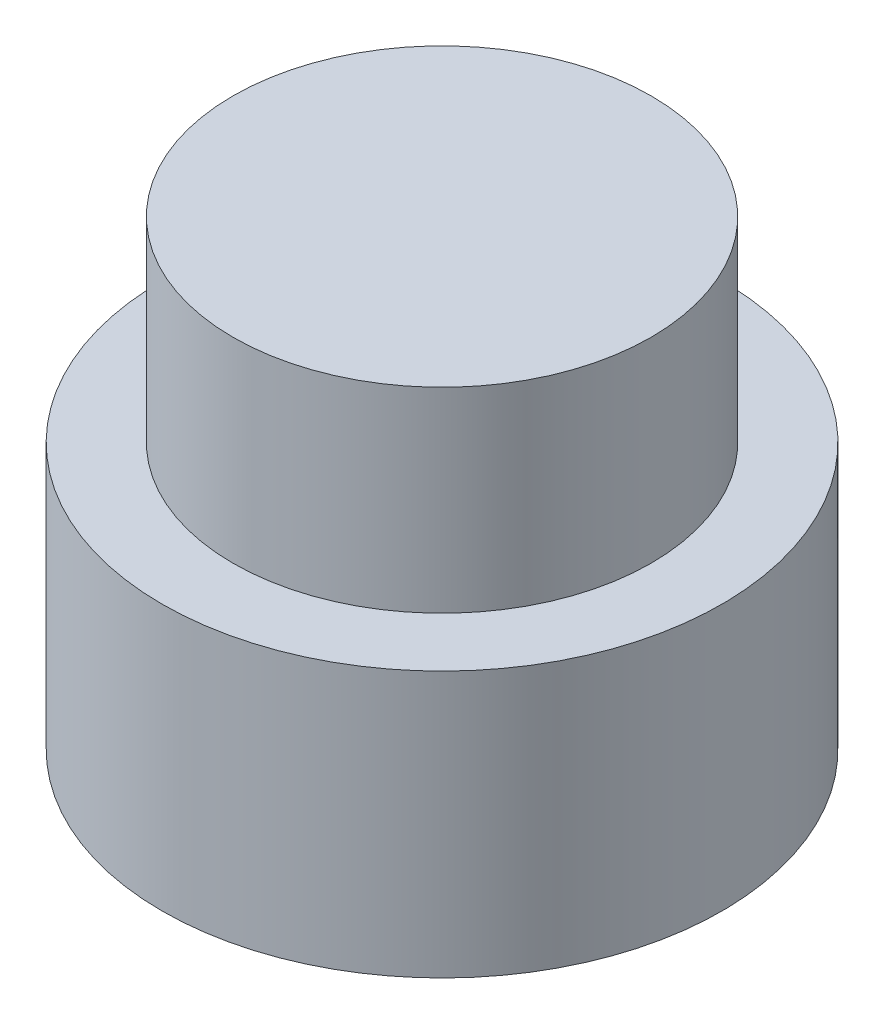
ISO-10303-21;
HEADER;
FILE_DESCRIPTION(('STEP AP214'),'2;1');
FILE_NAME('part.step','',(''),(''),'','','');
FILE_SCHEMA(('AUTOMOTIVE_DESIGN { 1 0 10303 214 1 1 1 1 }'));
ENDSEC;
DATA;
#1=APPLICATION_CONTEXT('core data for automotive mechanical design processes');
#2=APPLICATION_PROTOCOL_DEFINITION('international standard','automotive_design',2000,#1);
#3=PRODUCT_CONTEXT('',#1,'mechanical');
#4=PRODUCT('Part','Part','',(#3));
#5=PRODUCT_RELATED_PRODUCT_CATEGORY('part','',(#4));
#6=PRODUCT_DEFINITION_FORMATION('','',#4);
#7=PRODUCT_DEFINITION_CONTEXT('part definition',#1,'design');
#8=PRODUCT_DEFINITION('design','',#6,#7);
#9=PRODUCT_DEFINITION_SHAPE('','',#8);
#10=(LENGTH_UNIT() NAMED_UNIT(*) SI_UNIT(.MILLI.,.METRE.));
#11=(NAMED_UNIT(*) PLANE_ANGLE_UNIT() SI_UNIT($,.RADIAN.));
#12=(NAMED_UNIT(*) SI_UNIT($,.STERADIAN.) SOLID_ANGLE_UNIT());
#13=UNCERTAINTY_MEASURE_WITH_UNIT(LENGTH_MEASURE(1.E-05),#10,'distance_accuracy_value','');
#14=(GEOMETRIC_REPRESENTATION_CONTEXT(3) GLOBAL_UNCERTAINTY_ASSIGNED_CONTEXT((#13)) GLOBAL_UNIT_ASSIGNED_CONTEXT((#10,
#11,#12)) REPRESENTATION_CONTEXT('',''));
#15=CARTESIAN_POINT('',(0.,0.,0.));
#16=DIRECTION('',(0.,0.,1.));
#17=DIRECTION('',(1.,0.,0.));
#18=AXIS2_PLACEMENT_3D('',#15,#16,#17);
#19=CARTESIAN_POINT('',(0.,0.,0.));
#20=DIRECTION('',(0.,1.,0.));
#21=DIRECTION('',(0.,0.,1.));
#22=AXIS2_PLACEMENT_3D('',#19,#20,#21);
#23=PLANE('',#22);
#24=CARTESIAN_POINT('',(0.,0.,0.));
#25=DIRECTION('',(0.,-1.,0.));
#26=DIRECTION('',(0.,0.,-1.));
#27=AXIS2_PLACEMENT_3D('',#24,#25,#26);
#28=CIRCLE('',#27,2.5);
#29=CARTESIAN_POINT('',(0.,0.,-2.5));
#30=VERTEX_POINT('',#29);
#31=EDGE_CURVE('E67',#30,#30,#28,.T.);
#32=ORIENTED_EDGE('',*,*,#31,.F.);
#33=EDGE_LOOP('',(#32));
#34=FACE_BOUND('',#33,.T.);
#35=CARTESIAN_POINT('',(0.,0.,0.));
#36=DIRECTION('',(0.,1.,0.));
#37=DIRECTION('',(0.,0.,1.));
#38=AXIS2_PLACEMENT_3D('',#35,#36,#37);
#39=CIRCLE('',#38,7.9);
#40=CARTESIAN_POINT('',(0.,0.,7.9));
#41=VERTEX_POINT('',#40);
#42=EDGE_CURVE('E10',#41,#41,#39,.T.);
#43=ORIENTED_EDGE('',*,*,#42,.F.);
#44=EDGE_LOOP('',(#43));
#45=FACE_BOUND('',#44,.T.);
#46=ADVANCED_FACE('F43',(#34,#45),#23,.F.);
#47=CARTESIAN_POINT('',(0.,13.0223744292237,0.));
#48=DIRECTION('',(0.,1.,0.));
#49=DIRECTION('',(0.,0.,1.));
#50=AXIS2_PLACEMENT_3D('',#47,#48,#49);
#51=CYLINDRICAL_SURFACE('',#50,7.9);
#52=CARTESIAN_POINT('',(0.,7.5,0.));
#53=DIRECTION('',(0.,1.,0.));
#54=DIRECTION('',(0.,0.,1.));
#55=AXIS2_PLACEMENT_3D('',#52,#53,#54);
#56=CIRCLE('',#55,7.9);
#57=CARTESIAN_POINT('',(0.,7.5,7.9));
#58=VERTEX_POINT('',#57);
#59=EDGE_CURVE('E50',#58,#58,#56,.T.);
#60=ORIENTED_EDGE('',*,*,#59,.F.);
#61=EDGE_LOOP('',(#60));
#62=FACE_BOUND('',#61,.T.);
#63=ORIENTED_EDGE('',*,*,#42,.T.);
#64=EDGE_LOOP('',(#63));
#65=FACE_BOUND('',#64,.T.);
#66=ADVANCED_FACE('F86',(#62,#65),#51,.T.);
#67=CARTESIAN_POINT('',(7.9,7.5,0.));
#68=DIRECTION('',(0.,-1.,0.));
#69=DIRECTION('',(0.,0.,-1.));
#70=AXIS2_PLACEMENT_3D('',#67,#68,#69);
#71=PLANE('',#70);
#72=CARTESIAN_POINT('',(0.,7.5,0.));
#73=DIRECTION('',(0.,1.,0.));
#74=DIRECTION('',(0.,0.,1.));
#75=AXIS2_PLACEMENT_3D('',#72,#73,#74);
#76=CIRCLE('',#75,5.9);
#77=CARTESIAN_POINT('',(0.,7.5,5.9));
#78=VERTEX_POINT('',#77);
#79=EDGE_CURVE('E55',#78,#78,#76,.T.);
#80=ORIENTED_EDGE('',*,*,#79,.F.);
#81=EDGE_LOOP('',(#80));
#82=FACE_BOUND('',#81,.T.);
#83=ORIENTED_EDGE('',*,*,#59,.T.);
#84=EDGE_LOOP('',(#83));
#85=FACE_BOUND('',#84,.T.);
#86=ADVANCED_FACE('F91',(#82,#85),#71,.F.);
#87=CARTESIAN_POINT('',(0.,13.0223744292237,0.));
#88=DIRECTION('',(0.,1.,0.));
#89=DIRECTION('',(0.,0.,1.));
#90=AXIS2_PLACEMENT_3D('',#87,#88,#89);
#91=CYLINDRICAL_SURFACE('',#90,5.9);
#92=CARTESIAN_POINT('',(0.,13.0223744292237,0.));
#93=DIRECTION('',(0.,1.,0.));
#94=DIRECTION('',(0.,0.,1.));
#95=AXIS2_PLACEMENT_3D('',#92,#93,#94);
#96=CIRCLE('',#95,5.9);
#97=CARTESIAN_POINT('',(0.,13.0223744292237,5.9));
#98=VERTEX_POINT('',#97);
#99=EDGE_CURVE('E60',#98,#98,#96,.T.);
#100=ORIENTED_EDGE('',*,*,#99,.F.);
#101=EDGE_LOOP('',(#100));
#102=FACE_BOUND('',#101,.T.);
#103=ORIENTED_EDGE('',*,*,#79,.T.);
#104=EDGE_LOOP('',(#103));
#105=FACE_BOUND('',#104,.T.);
#106=ADVANCED_FACE('F96',(#102,#105),#91,.T.);
#107=CARTESIAN_POINT('',(5.9,13.0223744292237,0.));
#108=DIRECTION('',(0.,-1.,0.));
#109=DIRECTION('',(0.,0.,-1.));
#110=AXIS2_PLACEMENT_3D('',#107,#108,#109);
#111=PLANE('',#110);
#112=ORIENTED_EDGE('',*,*,#99,.T.);
#113=EDGE_LOOP('',(#112));
#114=FACE_BOUND('',#113,.T.);
#115=ADVANCED_FACE('F80',(#114),#111,.F.);
#116=CARTESIAN_POINT('',(0.,10.,0.));
#117=DIRECTION('',(0.,-1.,0.));
#118=DIRECTION('',(0.,0.,-1.));
#119=AXIS2_PLACEMENT_3D('',#116,#117,#118);
#120=CYLINDRICAL_SURFACE('',#119,2.5);
#121=CARTESIAN_POINT('',(0.,10.,0.));
#122=DIRECTION('',(0.,-1.,0.));
#123=DIRECTION('',(0.,0.,-1.));
#124=AXIS2_PLACEMENT_3D('',#121,#122,#123);
#125=CIRCLE('',#124,2.5);
#126=CARTESIAN_POINT('',(0.,10.,-2.5));
#127=VERTEX_POINT('',#126);
#128=EDGE_CURVE('E66',#127,#127,#125,.T.);
#129=ORIENTED_EDGE('',*,*,#128,.F.);
#130=EDGE_LOOP('',(#129));
#131=FACE_BOUND('',#130,.T.);
#132=ORIENTED_EDGE('',*,*,#31,.T.);
#133=EDGE_LOOP('',(#132));
#134=FACE_BOUND('',#133,.T.);
#135=ADVANCED_FACE('F77',(#131,#134),#120,.F.);
#136=CARTESIAN_POINT('',(0.,10.,0.));
#137=DIRECTION('',(0.,-1.,0.));
#138=DIRECTION('',(0.,0.,-1.));
#139=AXIS2_PLACEMENT_3D('',#136,#137,#138);
#140=PLANE('',#139);
#141=ORIENTED_EDGE('',*,*,#128,.T.);
#142=EDGE_LOOP('',(#141));
#143=FACE_BOUND('',#142,.T.);
#144=ADVANCED_FACE('F75',(#143),#140,.T.);
#145=CLOSED_SHELL('',(#46,#66,#86,#106,#115,#135,#144));
#146=MANIFOLD_SOLID_BREP('B2',#145);
#147=ADVANCED_BREP_SHAPE_REPRESENTATION('',(#18,#146),#14);
#148=SHAPE_DEFINITION_REPRESENTATION(#9,#147);
ENDSEC;
END-ISO-10303-21;
